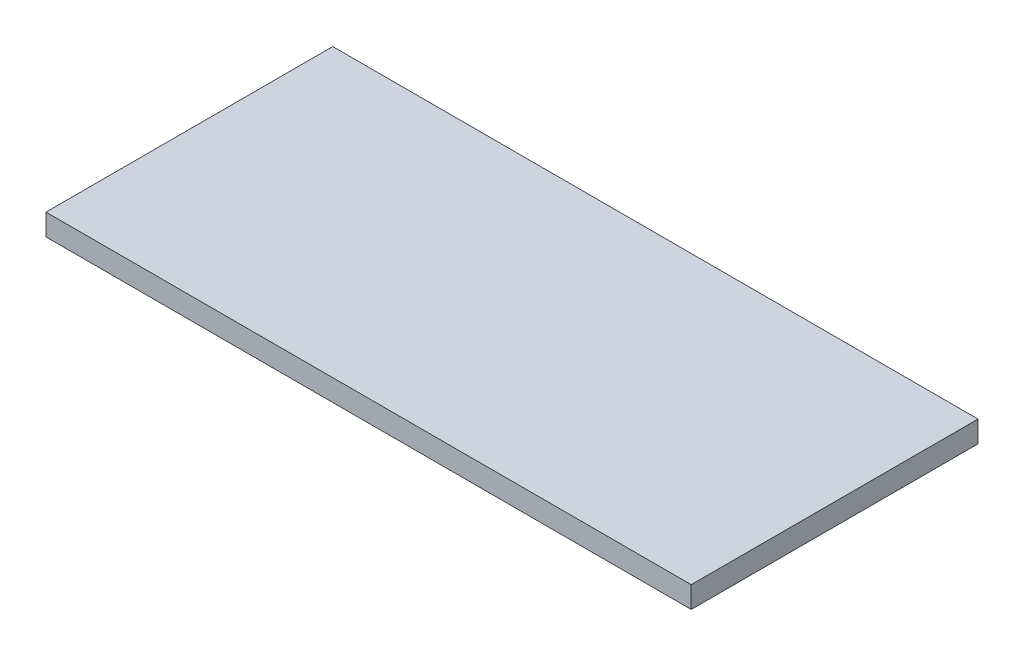
ISO-10303-21;
HEADER;
FILE_DESCRIPTION(('STEP AP214'),'2;1');
FILE_NAME('part.step','',(''),(''),'','','');
FILE_SCHEMA(('AUTOMOTIVE_DESIGN { 1 0 10303 214 1 1 1 1 }'));
ENDSEC;
DATA;
#1=APPLICATION_CONTEXT('core data for automotive mechanical design processes');
#2=APPLICATION_PROTOCOL_DEFINITION('international standard','automotive_design',2000,#1);
#3=PRODUCT_CONTEXT('',#1,'mechanical');
#4=PRODUCT('Part','Part','',(#3));
#5=PRODUCT_RELATED_PRODUCT_CATEGORY('part','',(#4));
#6=PRODUCT_DEFINITION_FORMATION('','',#4);
#7=PRODUCT_DEFINITION_CONTEXT('part definition',#1,'design');
#8=PRODUCT_DEFINITION('design','',#6,#7);
#9=PRODUCT_DEFINITION_SHAPE('','',#8);
#10=(LENGTH_UNIT() NAMED_UNIT(*) SI_UNIT(.MILLI.,.METRE.));
#11=(NAMED_UNIT(*) PLANE_ANGLE_UNIT() SI_UNIT($,.RADIAN.));
#12=(NAMED_UNIT(*) SI_UNIT($,.STERADIAN.) SOLID_ANGLE_UNIT());
#13=UNCERTAINTY_MEASURE_WITH_UNIT(LENGTH_MEASURE(1.E-05),#10,'distance_accuracy_value','');
#14=(GEOMETRIC_REPRESENTATION_CONTEXT(3) GLOBAL_UNCERTAINTY_ASSIGNED_CONTEXT((#13)) GLOBAL_UNIT_ASSIGNED_CONTEXT((#10,
#11,#12)) REPRESENTATION_CONTEXT('',''));
#15=CARTESIAN_POINT('',(0.,0.,0.));
#16=DIRECTION('',(0.,0.,1.));
#17=DIRECTION('',(1.,0.,0.));
#18=AXIS2_PLACEMENT_3D('',#15,#16,#17);
#19=CARTESIAN_POINT('',(-49.0909090909091,3.,-22.9855371900826));
#20=DIRECTION('',(1.,0.,0.));
#21=DIRECTION('',(0.,0.,-1.));
#22=AXIS2_PLACEMENT_3D('',#19,#20,#21);
#23=PLANE('',#22);
#24=DIRECTION('',(0.,0.,1.));
#25=VECTOR('',#24,1.);
#26=CARTESIAN_POINT('',(-49.0909090909091,0.,-22.9855371900826));
#27=LINE('',#26,#25);
#28=CARTESIAN_POINT('',(-49.0909090909091,0.,-22.9855371900826));
#29=VERTEX_POINT('',#28);
#30=CARTESIAN_POINT('',(-49.0909090909091,0.,17.0144628099174));
#31=VERTEX_POINT('',#30);
#32=EDGE_CURVE('E96',#29,#31,#27,.T.);
#33=ORIENTED_EDGE('',*,*,#32,.T.);
#34=DIRECTION('',(0.,-1.,0.));
#35=VECTOR('',#34,1.);
#36=CARTESIAN_POINT('',(-49.0909090909091,3.,17.0144628099174));
#37=LINE('',#36,#35);
#38=CARTESIAN_POINT('',(-49.0909090909091,3.,17.0144628099174));
#39=VERTEX_POINT('',#38);
#40=EDGE_CURVE('E11',#39,#31,#37,.T.);
#41=ORIENTED_EDGE('',*,*,#40,.F.);
#42=DIRECTION('',(0.,0.,1.));
#43=VECTOR('',#42,1.);
#44=CARTESIAN_POINT('',(-49.0909090909091,3.,-22.9855371900826));
#45=LINE('',#44,#43);
#46=CARTESIAN_POINT('',(-49.0909090909091,3.,-22.9855371900826));
#47=VERTEX_POINT('',#46);
#48=EDGE_CURVE('E84',#47,#39,#45,.T.);
#49=ORIENTED_EDGE('',*,*,#48,.F.);
#50=DIRECTION('',(0.,-1.,0.));
#51=VECTOR('',#50,1.);
#52=CARTESIAN_POINT('',(-49.0909090909091,3.,-22.9855371900826));
#53=LINE('',#52,#51);
#54=EDGE_CURVE('E92',#47,#29,#53,.T.);
#55=ORIENTED_EDGE('',*,*,#54,.T.);
#56=EDGE_LOOP('',(#33,#41,#49,#55));
#57=FACE_BOUND('',#56,.T.);
#58=ADVANCED_FACE('F33',(#57),#23,.F.);
#59=CARTESIAN_POINT('',(-49.0909090909091,3.,17.0144628099174));
#60=DIRECTION('',(0.,0.,-1.));
#61=DIRECTION('',(-1.,0.,0.));
#62=AXIS2_PLACEMENT_3D('',#59,#60,#61);
#63=PLANE('',#62);
#64=DIRECTION('',(1.,0.,0.));
#65=VECTOR('',#64,1.);
#66=CARTESIAN_POINT('',(-49.0909090909091,0.,17.0144628099174));
#67=LINE('',#66,#65);
#68=CARTESIAN_POINT('',(40.9090909090909,0.,17.0144628099174));
#69=VERTEX_POINT('',#68);
#70=EDGE_CURVE('E88',#31,#69,#67,.T.);
#71=ORIENTED_EDGE('',*,*,#70,.T.);
#72=DIRECTION('',(0.,-1.,0.));
#73=VECTOR('',#72,1.);
#74=CARTESIAN_POINT('',(40.9090909090909,3.,17.0144628099174));
#75=LINE('',#74,#73);
#76=CARTESIAN_POINT('',(40.9090909090909,3.,17.0144628099174));
#77=VERTEX_POINT('',#76);
#78=EDGE_CURVE('E41',#77,#69,#75,.T.);
#79=ORIENTED_EDGE('',*,*,#78,.F.);
#80=DIRECTION('',(1.,0.,0.));
#81=VECTOR('',#80,1.);
#82=CARTESIAN_POINT('',(-49.0909090909091,3.,17.0144628099174));
#83=LINE('',#82,#81);
#84=EDGE_CURVE('E79',#39,#77,#83,.T.);
#85=ORIENTED_EDGE('',*,*,#84,.F.);
#86=ORIENTED_EDGE('',*,*,#40,.T.);
#87=EDGE_LOOP('',(#71,#79,#85,#86));
#88=FACE_BOUND('',#87,.T.);
#89=ADVANCED_FACE('F87',(#88),#63,.F.);
#90=CARTESIAN_POINT('',(40.9090909090909,3.,-22.9855371900826));
#91=DIRECTION('',(-1.,0.,0.));
#92=DIRECTION('',(0.,0.,1.));
#93=AXIS2_PLACEMENT_3D('',#90,#91,#92);
#94=PLANE('',#93);
#95=DIRECTION('',(0.,0.,-1.));
#96=VECTOR('',#95,1.);
#97=CARTESIAN_POINT('',(40.9090909090909,0.,-22.9855371900826));
#98=LINE('',#97,#96);
#99=CARTESIAN_POINT('',(40.9090909090909,0.,-22.9855371900826));
#100=VERTEX_POINT('',#99);
#101=EDGE_CURVE('E66',#69,#100,#98,.T.);
#102=ORIENTED_EDGE('',*,*,#101,.T.);
#103=DIRECTION('',(0.,-1.,0.));
#104=VECTOR('',#103,1.);
#105=CARTESIAN_POINT('',(40.9090909090909,3.,-22.9855371900826));
#106=LINE('',#105,#104);
#107=CARTESIAN_POINT('',(40.9090909090909,3.,-22.9855371900826));
#108=VERTEX_POINT('',#107);
#109=EDGE_CURVE('E89',#108,#100,#106,.T.);
#110=ORIENTED_EDGE('',*,*,#109,.F.);
#111=DIRECTION('',(0.,0.,-1.));
#112=VECTOR('',#111,1.);
#113=CARTESIAN_POINT('',(40.9090909090909,3.,-22.9855371900826));
#114=LINE('',#113,#112);
#115=EDGE_CURVE('E82',#77,#108,#114,.T.);
#116=ORIENTED_EDGE('',*,*,#115,.F.);
#117=ORIENTED_EDGE('',*,*,#78,.T.);
#118=EDGE_LOOP('',(#102,#110,#116,#117));
#119=FACE_BOUND('',#118,.T.);
#120=ADVANCED_FACE('F90',(#119),#94,.F.);
#121=CARTESIAN_POINT('',(-49.0909090909091,3.,-22.9855371900826));
#122=DIRECTION('',(0.,0.,1.));
#123=DIRECTION('',(1.,0.,0.));
#124=AXIS2_PLACEMENT_3D('',#121,#122,#123);
#125=PLANE('',#124);
#126=DIRECTION('',(-1.,0.,0.));
#127=VECTOR('',#126,1.);
#128=CARTESIAN_POINT('',(-49.0909090909091,0.,-22.9855371900826));
#129=LINE('',#128,#127);
#130=EDGE_CURVE('E72',#100,#29,#129,.T.);
#131=ORIENTED_EDGE('',*,*,#130,.T.);
#132=ORIENTED_EDGE('',*,*,#54,.F.);
#133=DIRECTION('',(-1.,0.,0.));
#134=VECTOR('',#133,1.);
#135=CARTESIAN_POINT('',(-49.0909090909091,3.,-22.9855371900826));
#136=LINE('',#135,#134);
#137=EDGE_CURVE('E49',#108,#47,#136,.T.);
#138=ORIENTED_EDGE('',*,*,#137,.F.);
#139=ORIENTED_EDGE('',*,*,#109,.T.);
#140=EDGE_LOOP('',(#131,#132,#138,#139));
#141=FACE_BOUND('',#140,.T.);
#142=ADVANCED_FACE('F103',(#141),#125,.F.);
#143=CARTESIAN_POINT('',(0.,3.,0.));
#144=DIRECTION('',(0.,1.,0.));
#145=DIRECTION('',(0.,0.,1.));
#146=AXIS2_PLACEMENT_3D('',#143,#144,#145);
#147=PLANE('',#146);
#148=ORIENTED_EDGE('',*,*,#48,.T.);
#149=ORIENTED_EDGE('',*,*,#84,.T.);
#150=ORIENTED_EDGE('',*,*,#115,.T.);
#151=ORIENTED_EDGE('',*,*,#137,.T.);
#152=EDGE_LOOP('',(#148,#149,#150,#151));
#153=FACE_BOUND('',#152,.T.);
#154=ADVANCED_FACE('F80',(#153),#147,.T.);
#155=CARTESIAN_POINT('',(0.,0.,0.));
#156=DIRECTION('',(0.,1.,0.));
#157=DIRECTION('',(0.,0.,1.));
#158=AXIS2_PLACEMENT_3D('',#155,#156,#157);
#159=PLANE('',#158);
#160=ORIENTED_EDGE('',*,*,#32,.F.);
#161=ORIENTED_EDGE('',*,*,#130,.F.);
#162=ORIENTED_EDGE('',*,*,#101,.F.);
#163=ORIENTED_EDGE('',*,*,#70,.F.);
#164=EDGE_LOOP('',(#160,#161,#162,#163));
#165=FACE_BOUND('',#164,.T.);
#166=ADVANCED_FACE('F106',(#165),#159,.F.);
#167=CLOSED_SHELL('',(#58,#89,#120,#142,#154,#166));
#168=MANIFOLD_SOLID_BREP('B2',#167);
#169=ADVANCED_BREP_SHAPE_REPRESENTATION('',(#18,#168),#14);
#170=SHAPE_DEFINITION_REPRESENTATION(#9,#169);
ENDSEC;
END-ISO-10303-21;
